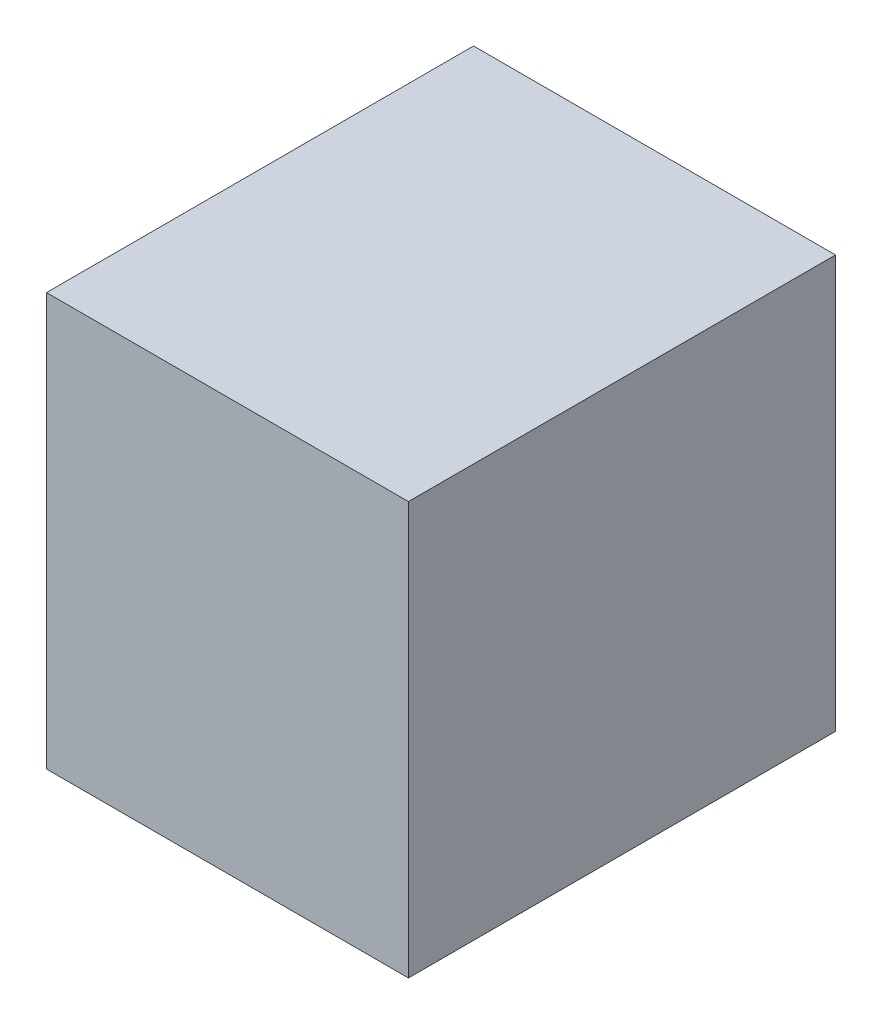
ISO-10303-21;
HEADER;
FILE_DESCRIPTION(('STEP AP214'),'2;1');
FILE_NAME('part.step','',(''),(''),'','','');
FILE_SCHEMA(('AUTOMOTIVE_DESIGN { 1 0 10303 214 1 1 1 1 }'));
ENDSEC;
DATA;
#1=APPLICATION_CONTEXT('core data for automotive mechanical design processes');
#2=APPLICATION_PROTOCOL_DEFINITION('international standard','automotive_design',2000,#1);
#3=PRODUCT_CONTEXT('',#1,'mechanical');
#4=PRODUCT('Part','Part','',(#3));
#5=PRODUCT_RELATED_PRODUCT_CATEGORY('part','',(#4));
#6=PRODUCT_DEFINITION_FORMATION('','',#4);
#7=PRODUCT_DEFINITION_CONTEXT('part definition',#1,'design');
#8=PRODUCT_DEFINITION('design','',#6,#7);
#9=PRODUCT_DEFINITION_SHAPE('','',#8);
#10=(LENGTH_UNIT() NAMED_UNIT(*) SI_UNIT(.MILLI.,.METRE.));
#11=(NAMED_UNIT(*) PLANE_ANGLE_UNIT() SI_UNIT($,.RADIAN.));
#12=(NAMED_UNIT(*) SI_UNIT($,.STERADIAN.) SOLID_ANGLE_UNIT());
#13=UNCERTAINTY_MEASURE_WITH_UNIT(LENGTH_MEASURE(1.E-05),#10,'distance_accuracy_value','');
#14=(GEOMETRIC_REPRESENTATION_CONTEXT(3) GLOBAL_UNCERTAINTY_ASSIGNED_CONTEXT((#13)) GLOBAL_UNIT_ASSIGNED_CONTEXT((#10,
#11,#12)) REPRESENTATION_CONTEXT('',''));
#15=CARTESIAN_POINT('',(0.,0.,0.));
#16=DIRECTION('',(0.,0.,1.));
#17=DIRECTION('',(1.,0.,0.));
#18=AXIS2_PLACEMENT_3D('',#15,#16,#17);
#19=CARTESIAN_POINT('',(-306.972789115646,258.658008658009,590.));
#20=DIRECTION('',(1.,0.,0.));
#21=DIRECTION('',(0.,1.,0.));
#22=AXIS2_PLACEMENT_3D('',#19,#20,#21);
#23=PLANE('',#22);
#24=DIRECTION('',(0.,-1.,0.));
#25=VECTOR('',#24,1.);
#26=CARTESIAN_POINT('',(-306.972789115646,258.658008658009,0.));
#27=LINE('',#26,#25);
#28=CARTESIAN_POINT('',(-306.972789115646,258.658008658009,0.));
#29=VERTEX_POINT('',#28);
#30=CARTESIAN_POINT('',(-306.972789115646,-311.341991341991,0.));
#31=VERTEX_POINT('',#30);
#32=EDGE_CURVE('E96',#29,#31,#27,.T.);
#33=ORIENTED_EDGE('',*,*,#32,.T.);
#34=DIRECTION('',(0.,0.,-1.));
#35=VECTOR('',#34,1.);
#36=CARTESIAN_POINT('',(-306.972789115646,-311.341991341991,590.));
#37=LINE('',#36,#35);
#38=CARTESIAN_POINT('',(-306.972789115646,-311.341991341991,590.));
#39=VERTEX_POINT('',#38);
#40=EDGE_CURVE('E11',#39,#31,#37,.T.);
#41=ORIENTED_EDGE('',*,*,#40,.F.);
#42=DIRECTION('',(0.,-1.,0.));
#43=VECTOR('',#42,1.);
#44=CARTESIAN_POINT('',(-306.972789115646,258.658008658009,590.));
#45=LINE('',#44,#43);
#46=CARTESIAN_POINT('',(-306.972789115646,258.658008658009,590.));
#47=VERTEX_POINT('',#46);
#48=EDGE_CURVE('E84',#47,#39,#45,.T.);
#49=ORIENTED_EDGE('',*,*,#48,.F.);
#50=DIRECTION('',(0.,0.,-1.));
#51=VECTOR('',#50,1.);
#52=CARTESIAN_POINT('',(-306.972789115646,258.658008658009,590.));
#53=LINE('',#52,#51);
#54=EDGE_CURVE('E92',#47,#29,#53,.T.);
#55=ORIENTED_EDGE('',*,*,#54,.T.);
#56=EDGE_LOOP('',(#33,#41,#49,#55));
#57=FACE_BOUND('',#56,.T.);
#58=ADVANCED_FACE('F33',(#57),#23,.F.);
#59=CARTESIAN_POINT('',(-306.972789115646,-311.341991341991,590.));
#60=DIRECTION('',(0.,1.,0.));
#61=DIRECTION('',(0.,0.,1.));
#62=AXIS2_PLACEMENT_3D('',#59,#60,#61);
#63=PLANE('',#62);
#64=DIRECTION('',(1.,0.,0.));
#65=VECTOR('',#64,1.);
#66=CARTESIAN_POINT('',(-306.972789115646,-311.341991341991,0.));
#67=LINE('',#66,#65);
#68=CARTESIAN_POINT('',(193.027210884354,-311.341991341991,0.));
#69=VERTEX_POINT('',#68);
#70=EDGE_CURVE('E88',#31,#69,#67,.T.);
#71=ORIENTED_EDGE('',*,*,#70,.T.);
#72=DIRECTION('',(0.,0.,-1.));
#73=VECTOR('',#72,1.);
#74=CARTESIAN_POINT('',(193.027210884354,-311.341991341991,590.));
#75=LINE('',#74,#73);
#76=CARTESIAN_POINT('',(193.027210884354,-311.341991341991,590.));
#77=VERTEX_POINT('',#76);
#78=EDGE_CURVE('E41',#77,#69,#75,.T.);
#79=ORIENTED_EDGE('',*,*,#78,.F.);
#80=DIRECTION('',(1.,0.,0.));
#81=VECTOR('',#80,1.);
#82=CARTESIAN_POINT('',(-306.972789115646,-311.341991341991,590.));
#83=LINE('',#82,#81);
#84=EDGE_CURVE('E79',#39,#77,#83,.T.);
#85=ORIENTED_EDGE('',*,*,#84,.F.);
#86=ORIENTED_EDGE('',*,*,#40,.T.);
#87=EDGE_LOOP('',(#71,#79,#85,#86));
#88=FACE_BOUND('',#87,.T.);
#89=ADVANCED_FACE('F87',(#88),#63,.F.);
#90=CARTESIAN_POINT('',(193.027210884354,258.658008658009,590.));
#91=DIRECTION('',(-1.,0.,0.));
#92=DIRECTION('',(0.,-1.,0.));
#93=AXIS2_PLACEMENT_3D('',#90,#91,#92);
#94=PLANE('',#93);
#95=DIRECTION('',(0.,1.,0.));
#96=VECTOR('',#95,1.);
#97=CARTESIAN_POINT('',(193.027210884354,258.658008658009,0.));
#98=LINE('',#97,#96);
#99=CARTESIAN_POINT('',(193.027210884354,258.658008658009,0.));
#100=VERTEX_POINT('',#99);
#101=EDGE_CURVE('E66',#69,#100,#98,.T.);
#102=ORIENTED_EDGE('',*,*,#101,.T.);
#103=DIRECTION('',(0.,0.,-1.));
#104=VECTOR('',#103,1.);
#105=CARTESIAN_POINT('',(193.027210884354,258.658008658009,590.));
#106=LINE('',#105,#104);
#107=CARTESIAN_POINT('',(193.027210884354,258.658008658009,590.));
#108=VERTEX_POINT('',#107);
#109=EDGE_CURVE('E89',#108,#100,#106,.T.);
#110=ORIENTED_EDGE('',*,*,#109,.F.);
#111=DIRECTION('',(0.,1.,0.));
#112=VECTOR('',#111,1.);
#113=CARTESIAN_POINT('',(193.027210884354,258.658008658009,590.));
#114=LINE('',#113,#112);
#115=EDGE_CURVE('E82',#77,#108,#114,.T.);
#116=ORIENTED_EDGE('',*,*,#115,.F.);
#117=ORIENTED_EDGE('',*,*,#78,.T.);
#118=EDGE_LOOP('',(#102,#110,#116,#117));
#119=FACE_BOUND('',#118,.T.);
#120=ADVANCED_FACE('F90',(#119),#94,.F.);
#121=CARTESIAN_POINT('',(-306.972789115646,258.658008658009,590.));
#122=DIRECTION('',(0.,-1.,0.));
#123=DIRECTION('',(0.,0.,-1.));
#124=AXIS2_PLACEMENT_3D('',#121,#122,#123);
#125=PLANE('',#124);
#126=DIRECTION('',(-1.,0.,0.));
#127=VECTOR('',#126,1.);
#128=CARTESIAN_POINT('',(-306.972789115646,258.658008658009,0.));
#129=LINE('',#128,#127);
#130=EDGE_CURVE('E72',#100,#29,#129,.T.);
#131=ORIENTED_EDGE('',*,*,#130,.T.);
#132=ORIENTED_EDGE('',*,*,#54,.F.);
#133=DIRECTION('',(-1.,0.,0.));
#134=VECTOR('',#133,1.);
#135=CARTESIAN_POINT('',(-306.972789115646,258.658008658009,590.));
#136=LINE('',#135,#134);
#137=EDGE_CURVE('E49',#108,#47,#136,.T.);
#138=ORIENTED_EDGE('',*,*,#137,.F.);
#139=ORIENTED_EDGE('',*,*,#109,.T.);
#140=EDGE_LOOP('',(#131,#132,#138,#139));
#141=FACE_BOUND('',#140,.T.);
#142=ADVANCED_FACE('F103',(#141),#125,.F.);
#143=CARTESIAN_POINT('',(0.,0.,590.));
#144=DIRECTION('',(0.,0.,1.));
#145=DIRECTION('',(1.,0.,0.));
#146=AXIS2_PLACEMENT_3D('',#143,#144,#145);
#147=PLANE('',#146);
#148=ORIENTED_EDGE('',*,*,#48,.T.);
#149=ORIENTED_EDGE('',*,*,#84,.T.);
#150=ORIENTED_EDGE('',*,*,#115,.T.);
#151=ORIENTED_EDGE('',*,*,#137,.T.);
#152=EDGE_LOOP('',(#148,#149,#150,#151));
#153=FACE_BOUND('',#152,.T.);
#154=ADVANCED_FACE('F80',(#153),#147,.T.);
#155=CARTESIAN_POINT('',(0.,0.,0.));
#156=DIRECTION('',(0.,0.,1.));
#157=DIRECTION('',(1.,0.,0.));
#158=AXIS2_PLACEMENT_3D('',#155,#156,#157);
#159=PLANE('',#158);
#160=ORIENTED_EDGE('',*,*,#32,.F.);
#161=ORIENTED_EDGE('',*,*,#130,.F.);
#162=ORIENTED_EDGE('',*,*,#101,.F.);
#163=ORIENTED_EDGE('',*,*,#70,.F.);
#164=EDGE_LOOP('',(#160,#161,#162,#163));
#165=FACE_BOUND('',#164,.T.);
#166=ADVANCED_FACE('F106',(#165),#159,.F.);
#167=CLOSED_SHELL('',(#58,#89,#120,#142,#154,#166));
#168=MANIFOLD_SOLID_BREP('B2',#167);
#169=ADVANCED_BREP_SHAPE_REPRESENTATION('',(#18,#168),#14);
#170=SHAPE_DEFINITION_REPRESENTATION(#9,#169);
ENDSEC;
END-ISO-10303-21;
